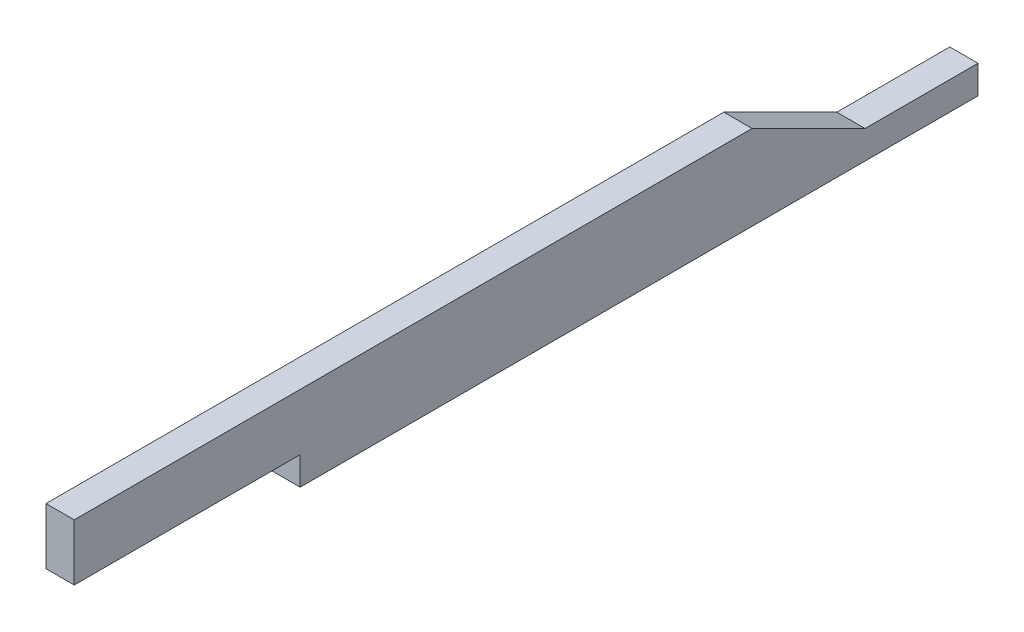
ISO-10303-21;
HEADER;
FILE_DESCRIPTION(('STEP AP214'),'2;1');
FILE_NAME('part.step','',(''),(''),'','','');
FILE_SCHEMA(('AUTOMOTIVE_DESIGN { 1 0 10303 214 1 1 1 1 }'));
ENDSEC;
DATA;
#1=APPLICATION_CONTEXT('core data for automotive mechanical design processes');
#2=APPLICATION_PROTOCOL_DEFINITION('international standard','automotive_design',2000,#1);
#3=PRODUCT_CONTEXT('',#1,'mechanical');
#4=PRODUCT('Part','Part','',(#3));
#5=PRODUCT_RELATED_PRODUCT_CATEGORY('part','',(#4));
#6=PRODUCT_DEFINITION_FORMATION('','',#4);
#7=PRODUCT_DEFINITION_CONTEXT('part definition',#1,'design');
#8=PRODUCT_DEFINITION('design','',#6,#7);
#9=PRODUCT_DEFINITION_SHAPE('','',#8);
#10=(LENGTH_UNIT() NAMED_UNIT(*) SI_UNIT(.MILLI.,.METRE.));
#11=(NAMED_UNIT(*) PLANE_ANGLE_UNIT() SI_UNIT($,.RADIAN.));
#12=(NAMED_UNIT(*) SI_UNIT($,.STERADIAN.) SOLID_ANGLE_UNIT());
#13=UNCERTAINTY_MEASURE_WITH_UNIT(LENGTH_MEASURE(1.E-05),#10,'distance_accuracy_value','');
#14=(GEOMETRIC_REPRESENTATION_CONTEXT(3) GLOBAL_UNCERTAINTY_ASSIGNED_CONTEXT((#13)) GLOBAL_UNIT_ASSIGNED_CONTEXT((#10,
#11,#12)) REPRESENTATION_CONTEXT('',''));
#15=CARTESIAN_POINT('',(0.,0.,0.));
#16=DIRECTION('',(0.,0.,1.));
#17=DIRECTION('',(1.,0.,0.));
#18=AXIS2_PLACEMENT_3D('',#15,#16,#17);
#19=CARTESIAN_POINT('',(0.,0.,203.2));
#20=DIRECTION('',(-1.,0.,0.));
#21=DIRECTION('',(0.,0.,1.));
#22=AXIS2_PLACEMENT_3D('',#19,#20,#21);
#23=PLANE('',#22);
#24=DIRECTION('',(0.,0.,1.));
#25=VECTOR('',#24,1.);
#26=CARTESIAN_POINT('',(0.,6.35,203.2));
#27=LINE('',#26,#25);
#28=CARTESIAN_POINT('',(0.,6.35,0.));
#29=VERTEX_POINT('',#28);
#30=CARTESIAN_POINT('',(0.,6.35,25.4));
#31=VERTEX_POINT('',#30);
#32=EDGE_CURVE('E47',#29,#31,#27,.T.);
#33=ORIENTED_EDGE('',*,*,#32,.T.);
#34=DIRECTION('',(0.,0.447213595499958,0.894427190999916));
#35=VECTOR('',#34,1.);
#36=CARTESIAN_POINT('',(0.,76.2,165.1));
#37=LINE('',#36,#35);
#38=CARTESIAN_POINT('',(0.,19.05,50.8));
#39=VERTEX_POINT('',#38);
#40=EDGE_CURVE('E143',#31,#39,#37,.T.);
#41=ORIENTED_EDGE('',*,*,#40,.T.);
#42=DIRECTION('',(0.,0.,-1.));
#43=VECTOR('',#42,1.);
#44=CARTESIAN_POINT('',(0.,19.05,203.2));
#45=LINE('',#44,#43);
#46=CARTESIAN_POINT('',(0.,19.05,203.2));
#47=VERTEX_POINT('',#46);
#48=EDGE_CURVE('E131',#47,#39,#45,.T.);
#49=ORIENTED_EDGE('',*,*,#48,.F.);
#50=DIRECTION('',(0.,1.,0.));
#51=VECTOR('',#50,1.);
#52=CARTESIAN_POINT('',(0.,0.,203.2));
#53=LINE('',#52,#51);
#54=CARTESIAN_POINT('',(0.,6.35,203.2));
#55=VERTEX_POINT('',#54);
#56=EDGE_CURVE('E118',#55,#47,#53,.T.);
#57=ORIENTED_EDGE('',*,*,#56,.F.);
#58=DIRECTION('',(0.,0.,-1.));
#59=VECTOR('',#58,1.);
#60=CARTESIAN_POINT('',(0.,6.35,203.2));
#61=LINE('',#60,#59);
#62=CARTESIAN_POINT('',(0.,6.34999999999999,152.4));
#63=VERTEX_POINT('',#62);
#64=EDGE_CURVE('E54',#55,#63,#61,.T.);
#65=ORIENTED_EDGE('',*,*,#64,.T.);
#66=DIRECTION('',(0.,-1.,0.));
#67=VECTOR('',#66,1.);
#68=CARTESIAN_POINT('',(0.,0.,152.4));
#69=LINE('',#68,#67);
#70=CARTESIAN_POINT('',(0.,0.,152.4));
#71=VERTEX_POINT('',#70);
#72=EDGE_CURVE('E120',#63,#71,#69,.T.);
#73=ORIENTED_EDGE('',*,*,#72,.T.);
#74=DIRECTION('',(0.,0.,-1.));
#75=VECTOR('',#74,1.);
#76=CARTESIAN_POINT('',(0.,0.,203.2));
#77=LINE('',#76,#75);
#78=CARTESIAN_POINT('',(0.,0.,0.));
#79=VERTEX_POINT('',#78);
#80=EDGE_CURVE('E124',#71,#79,#77,.T.);
#81=ORIENTED_EDGE('',*,*,#80,.T.);
#82=DIRECTION('',(0.,1.,0.));
#83=VECTOR('',#82,1.);
#84=CARTESIAN_POINT('',(0.,0.,0.));
#85=LINE('',#84,#83);
#86=EDGE_CURVE('E116',#79,#29,#85,.T.);
#87=ORIENTED_EDGE('',*,*,#86,.T.);
#88=EDGE_LOOP('',(#33,#41,#49,#57,#65,#73,#81,#87));
#89=FACE_BOUND('',#88,.T.);
#90=ADVANCED_FACE('F33',(#89),#23,.F.);
#91=CARTESIAN_POINT('',(0.,19.05,203.2));
#92=DIRECTION('',(0.,-1.,0.));
#93=DIRECTION('',(0.,0.,-1.));
#94=AXIS2_PLACEMENT_3D('',#91,#92,#93);
#95=PLANE('',#94);
#96=ORIENTED_EDGE('',*,*,#48,.T.);
#97=DIRECTION('',(-1.,0.,0.));
#98=VECTOR('',#97,1.);
#99=CARTESIAN_POINT('',(196.85,19.05,50.8));
#100=LINE('',#99,#98);
#101=CARTESIAN_POINT('',(-6.35,19.05,50.8));
#102=VERTEX_POINT('',#101);
#103=EDGE_CURVE('E164',#39,#102,#100,.T.);
#104=ORIENTED_EDGE('',*,*,#103,.T.);
#105=DIRECTION('',(0.,0.,-1.));
#106=VECTOR('',#105,1.);
#107=CARTESIAN_POINT('',(-6.35,19.05,203.2));
#108=LINE('',#107,#106);
#109=CARTESIAN_POINT('',(-6.35,19.05,203.2));
#110=VERTEX_POINT('',#109);
#111=EDGE_CURVE('E129',#110,#102,#108,.T.);
#112=ORIENTED_EDGE('',*,*,#111,.F.);
#113=DIRECTION('',(-1.,0.,0.));
#114=VECTOR('',#113,1.);
#115=CARTESIAN_POINT('',(0.,19.05,203.2));
#116=LINE('',#115,#114);
#117=EDGE_CURVE('E147',#47,#110,#116,.T.);
#118=ORIENTED_EDGE('',*,*,#117,.F.);
#119=EDGE_LOOP('',(#96,#104,#112,#118));
#120=FACE_BOUND('',#119,.T.);
#121=ADVANCED_FACE('F172',(#120),#95,.F.);
#122=CARTESIAN_POINT('',(-6.35,0.,203.2));
#123=DIRECTION('',(1.,0.,0.));
#124=DIRECTION('',(0.,0.,-1.));
#125=AXIS2_PLACEMENT_3D('',#122,#123,#124);
#126=PLANE('',#125);
#127=ORIENTED_EDGE('',*,*,#111,.T.);
#128=DIRECTION('',(0.,0.447213595499958,0.894427190999916));
#129=VECTOR('',#128,1.);
#130=CARTESIAN_POINT('',(-6.35,6.35,25.4));
#131=LINE('',#130,#129);
#132=CARTESIAN_POINT('',(-6.35,6.35,25.4));
#133=VERTEX_POINT('',#132);
#134=EDGE_CURVE('E110',#133,#102,#131,.T.);
#135=ORIENTED_EDGE('',*,*,#134,.F.);
#136=DIRECTION('',(0.,0.,1.));
#137=VECTOR('',#136,1.);
#138=CARTESIAN_POINT('',(-6.35,6.35,0.));
#139=LINE('',#138,#137);
#140=CARTESIAN_POINT('',(-6.35,6.35,0.));
#141=VERTEX_POINT('',#140);
#142=EDGE_CURVE('E98',#141,#133,#139,.T.);
#143=ORIENTED_EDGE('',*,*,#142,.F.);
#144=DIRECTION('',(0.,-1.,0.));
#145=VECTOR('',#144,1.);
#146=CARTESIAN_POINT('',(-6.35,0.,0.));
#147=LINE('',#146,#145);
#148=CARTESIAN_POINT('',(-6.35,0.,0.));
#149=VERTEX_POINT('',#148);
#150=EDGE_CURVE('E108',#141,#149,#147,.T.);
#151=ORIENTED_EDGE('',*,*,#150,.T.);
#152=DIRECTION('',(0.,0.,-1.));
#153=VECTOR('',#152,1.);
#154=CARTESIAN_POINT('',(-6.35,0.,203.2));
#155=LINE('',#154,#153);
#156=CARTESIAN_POINT('',(-6.35,0.,152.4));
#157=VERTEX_POINT('',#156);
#158=EDGE_CURVE('E126',#157,#149,#155,.T.);
#159=ORIENTED_EDGE('',*,*,#158,.F.);
#160=DIRECTION('',(0.,-1.,0.));
#161=VECTOR('',#160,1.);
#162=CARTESIAN_POINT('',(-6.35,0.,152.4));
#163=LINE('',#162,#161);
#164=CARTESIAN_POINT('',(-6.35,6.34999999999999,152.4));
#165=VERTEX_POINT('',#164);
#166=EDGE_CURVE('E142',#165,#157,#163,.T.);
#167=ORIENTED_EDGE('',*,*,#166,.F.);
#168=DIRECTION('',(0.,0.,-1.));
#169=VECTOR('',#168,1.);
#170=CARTESIAN_POINT('',(-6.35,6.35,203.2));
#171=LINE('',#170,#169);
#172=CARTESIAN_POINT('',(-6.35,6.35,203.2));
#173=VERTEX_POINT('',#172);
#174=EDGE_CURVE('E136',#173,#165,#171,.T.);
#175=ORIENTED_EDGE('',*,*,#174,.F.);
#176=DIRECTION('',(0.,-1.,0.));
#177=VECTOR('',#176,1.);
#178=CARTESIAN_POINT('',(-6.35,0.,203.2));
#179=LINE('',#178,#177);
#180=EDGE_CURVE('E127',#110,#173,#179,.T.);
#181=ORIENTED_EDGE('',*,*,#180,.F.);
#182=EDGE_LOOP('',(#127,#135,#143,#151,#159,#167,#175,#181));
#183=FACE_BOUND('',#182,.T.);
#184=ADVANCED_FACE('F106',(#183),#126,.F.);
#185=CARTESIAN_POINT('',(0.,0.,203.2));
#186=DIRECTION('',(0.,1.,0.));
#187=DIRECTION('',(0.,0.,1.));
#188=AXIS2_PLACEMENT_3D('',#185,#186,#187);
#189=PLANE('',#188);
#190=ORIENTED_EDGE('',*,*,#80,.F.);
#191=DIRECTION('',(-1.,0.,0.));
#192=VECTOR('',#191,1.);
#193=CARTESIAN_POINT('',(196.85,0.,152.4));
#194=LINE('',#193,#192);
#195=EDGE_CURVE('E155',#71,#157,#194,.T.);
#196=ORIENTED_EDGE('',*,*,#195,.T.);
#197=ORIENTED_EDGE('',*,*,#158,.T.);
#198=DIRECTION('',(1.,0.,0.));
#199=VECTOR('',#198,1.);
#200=CARTESIAN_POINT('',(0.,0.,0.));
#201=LINE('',#200,#199);
#202=EDGE_CURVE('E115',#149,#79,#201,.T.);
#203=ORIENTED_EDGE('',*,*,#202,.T.);
#204=EDGE_LOOP('',(#190,#196,#197,#203));
#205=FACE_BOUND('',#204,.T.);
#206=ADVANCED_FACE('F177',(#205),#189,.F.);
#207=CARTESIAN_POINT('',(0.,0.,203.2));
#208=DIRECTION('',(0.,0.,1.));
#209=DIRECTION('',(1.,0.,0.));
#210=AXIS2_PLACEMENT_3D('',#207,#208,#209);
#211=PLANE('',#210);
#212=DIRECTION('',(-1.,0.,0.));
#213=VECTOR('',#212,1.);
#214=CARTESIAN_POINT('',(0.,6.35,203.2));
#215=LINE('',#214,#213);
#216=EDGE_CURVE('E40',#55,#173,#215,.T.);
#217=ORIENTED_EDGE('',*,*,#216,.F.);
#218=ORIENTED_EDGE('',*,*,#56,.T.);
#219=ORIENTED_EDGE('',*,*,#117,.T.);
#220=ORIENTED_EDGE('',*,*,#180,.T.);
#221=EDGE_LOOP('',(#217,#218,#219,#220));
#222=FACE_BOUND('',#221,.T.);
#223=ADVANCED_FACE('F145',(#222),#211,.T.);
#224=CARTESIAN_POINT('',(0.,0.,0.));
#225=DIRECTION('',(0.,0.,1.));
#226=DIRECTION('',(1.,0.,0.));
#227=AXIS2_PLACEMENT_3D('',#224,#225,#226);
#228=PLANE('',#227);
#229=ORIENTED_EDGE('',*,*,#150,.F.);
#230=DIRECTION('',(1.,0.,0.));
#231=VECTOR('',#230,1.);
#232=CARTESIAN_POINT('',(0.,6.35,0.));
#233=LINE('',#232,#231);
#234=EDGE_CURVE('E11',#141,#29,#233,.T.);
#235=ORIENTED_EDGE('',*,*,#234,.T.);
#236=ORIENTED_EDGE('',*,*,#86,.F.);
#237=ORIENTED_EDGE('',*,*,#202,.F.);
#238=EDGE_LOOP('',(#229,#235,#236,#237));
#239=FACE_BOUND('',#238,.T.);
#240=ADVANCED_FACE('F113',(#239),#228,.F.);
#241=CARTESIAN_POINT('',(196.85,0.,152.4));
#242=DIRECTION('',(0.,0.,-1.));
#243=DIRECTION('',(-1.,0.,0.));
#244=AXIS2_PLACEMENT_3D('',#241,#242,#243);
#245=PLANE('',#244);
#246=DIRECTION('',(-1.,0.,0.));
#247=VECTOR('',#246,1.);
#248=CARTESIAN_POINT('',(196.85,6.34999999999999,152.4));
#249=LINE('',#248,#247);
#250=EDGE_CURVE('E156',#63,#165,#249,.T.);
#251=ORIENTED_EDGE('',*,*,#250,.T.);
#252=ORIENTED_EDGE('',*,*,#166,.T.);
#253=ORIENTED_EDGE('',*,*,#195,.F.);
#254=ORIENTED_EDGE('',*,*,#72,.F.);
#255=EDGE_LOOP('',(#251,#252,#253,#254));
#256=FACE_BOUND('',#255,.T.);
#257=ADVANCED_FACE('F179',(#256),#245,.F.);
#258=CARTESIAN_POINT('',(196.85,6.35,203.2));
#259=DIRECTION('',(0.,1.,0.));
#260=DIRECTION('',(0.,0.,1.));
#261=AXIS2_PLACEMENT_3D('',#258,#259,#260);
#262=PLANE('',#261);
#263=ORIENTED_EDGE('',*,*,#216,.T.);
#264=ORIENTED_EDGE('',*,*,#174,.T.);
#265=ORIENTED_EDGE('',*,*,#250,.F.);
#266=ORIENTED_EDGE('',*,*,#64,.F.);
#267=EDGE_LOOP('',(#263,#264,#265,#266));
#268=FACE_BOUND('',#267,.T.);
#269=ADVANCED_FACE('F135',(#268),#262,.F.);
#270=CARTESIAN_POINT('',(196.85,6.35,25.4));
#271=DIRECTION('',(0.,-0.894427190999916,0.447213595499958));
#272=DIRECTION('',(0.,-0.447213595499958,-0.894427190999916));
#273=AXIS2_PLACEMENT_3D('',#270,#271,#272);
#274=PLANE('',#273);
#275=DIRECTION('',(-1.,0.,0.));
#276=VECTOR('',#275,1.);
#277=CARTESIAN_POINT('',(196.85,6.35,25.4));
#278=LINE('',#277,#276);
#279=EDGE_CURVE('E165',#31,#133,#278,.T.);
#280=ORIENTED_EDGE('',*,*,#279,.T.);
#281=ORIENTED_EDGE('',*,*,#134,.T.);
#282=ORIENTED_EDGE('',*,*,#103,.F.);
#283=ORIENTED_EDGE('',*,*,#40,.F.);
#284=EDGE_LOOP('',(#280,#281,#282,#283));
#285=FACE_BOUND('',#284,.T.);
#286=ADVANCED_FACE('F170',(#285),#274,.F.);
#287=CARTESIAN_POINT('',(196.85,6.35,0.));
#288=DIRECTION('',(0.,-1.,0.));
#289=DIRECTION('',(0.,0.,-1.));
#290=AXIS2_PLACEMENT_3D('',#287,#288,#289);
#291=PLANE('',#290);
#292=ORIENTED_EDGE('',*,*,#234,.F.);
#293=ORIENTED_EDGE('',*,*,#142,.T.);
#294=ORIENTED_EDGE('',*,*,#279,.F.);
#295=ORIENTED_EDGE('',*,*,#32,.F.);
#296=EDGE_LOOP('',(#292,#293,#294,#295));
#297=FACE_BOUND('',#296,.T.);
#298=ADVANCED_FACE('F97',(#297),#291,.F.);
#299=CLOSED_SHELL('',(#90,#121,#184,#206,#223,#240,#257,#269,#286,#298));
#300=MANIFOLD_SOLID_BREP('B2',#299);
#301=ADVANCED_BREP_SHAPE_REPRESENTATION('',(#18,#300),#14);
#302=SHAPE_DEFINITION_REPRESENTATION(#9,#301);
ENDSEC;
END-ISO-10303-21;
